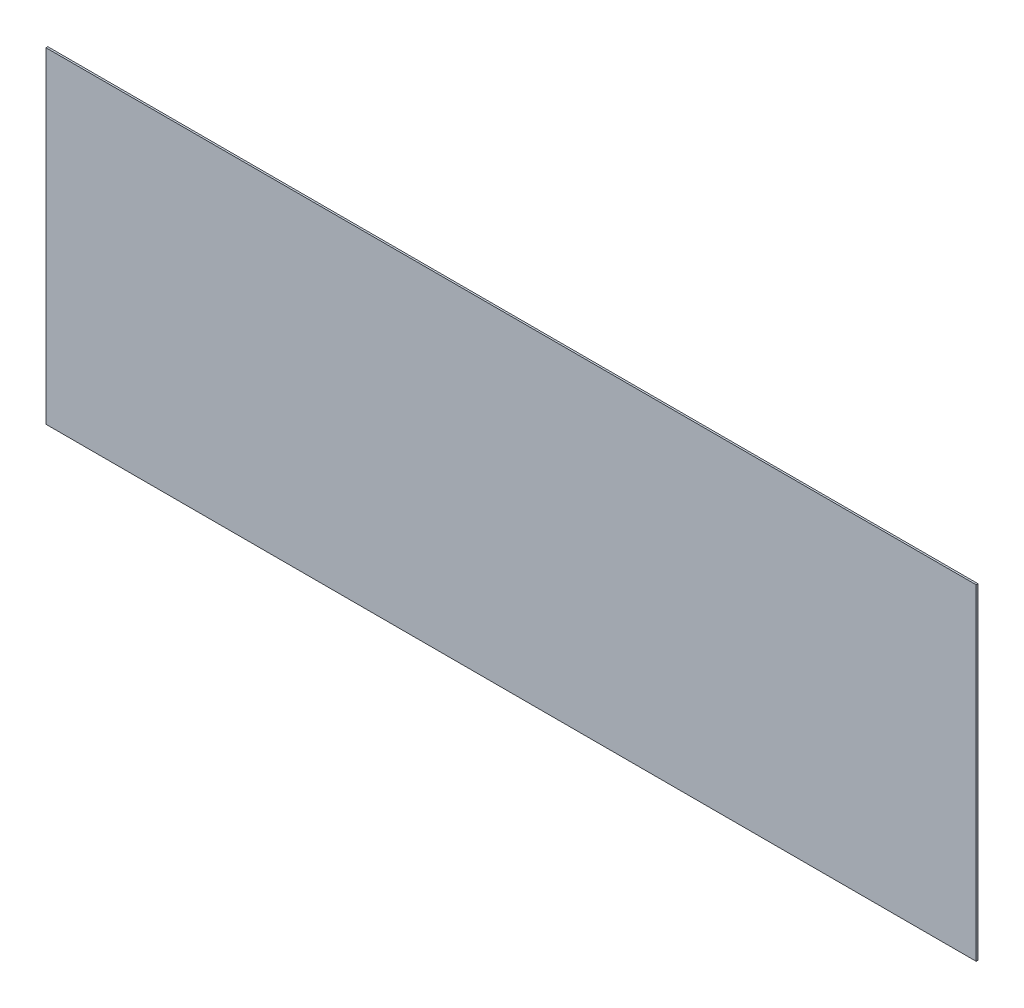
ISO-10303-21;
HEADER;
FILE_DESCRIPTION(('STEP AP214'),'2;1');
FILE_NAME('part.step','',(''),(''),'','','');
FILE_SCHEMA(('AUTOMOTIVE_DESIGN { 1 0 10303 214 1 1 1 1 }'));
ENDSEC;
DATA;
#1=APPLICATION_CONTEXT('core data for automotive mechanical design processes');
#2=APPLICATION_PROTOCOL_DEFINITION('international standard','automotive_design',2000,#1);
#3=PRODUCT_CONTEXT('',#1,'mechanical');
#4=PRODUCT('Part','Part','',(#3));
#5=PRODUCT_RELATED_PRODUCT_CATEGORY('part','',(#4));
#6=PRODUCT_DEFINITION_FORMATION('','',#4);
#7=PRODUCT_DEFINITION_CONTEXT('part definition',#1,'design');
#8=PRODUCT_DEFINITION('design','',#6,#7);
#9=PRODUCT_DEFINITION_SHAPE('','',#8);
#10=(LENGTH_UNIT() NAMED_UNIT(*) SI_UNIT(.MILLI.,.METRE.));
#11=(NAMED_UNIT(*) PLANE_ANGLE_UNIT() SI_UNIT($,.RADIAN.));
#12=(NAMED_UNIT(*) SI_UNIT($,.STERADIAN.) SOLID_ANGLE_UNIT());
#13=UNCERTAINTY_MEASURE_WITH_UNIT(LENGTH_MEASURE(1.E-05),#10,'distance_accuracy_value','');
#14=(GEOMETRIC_REPRESENTATION_CONTEXT(3) GLOBAL_UNCERTAINTY_ASSIGNED_CONTEXT((#13)) GLOBAL_UNIT_ASSIGNED_CONTEXT((#10,
#11,#12)) REPRESENTATION_CONTEXT('',''));
#15=CARTESIAN_POINT('',(0.,0.,0.));
#16=DIRECTION('',(0.,0.,1.));
#17=DIRECTION('',(1.,0.,0.));
#18=AXIS2_PLACEMENT_3D('',#15,#16,#17);
#19=CARTESIAN_POINT('',(796.925,279.4,0.));
#20=DIRECTION('',(1.,0.,0.));
#21=DIRECTION('',(0.,0.,-1.));
#22=AXIS2_PLACEMENT_3D('',#19,#20,#21);
#23=PLANE('',#22);
#24=DIRECTION('',(0.,1.,0.));
#25=VECTOR('',#24,1.);
#26=CARTESIAN_POINT('',(796.925,-279.4,0.));
#27=LINE('',#26,#25);
#28=CARTESIAN_POINT('',(796.925,-279.4,0.));
#29=VERTEX_POINT('',#28);
#30=CARTESIAN_POINT('',(796.925,279.4,0.));
#31=VERTEX_POINT('',#30);
#32=EDGE_CURVE('E34',#29,#31,#27,.T.);
#33=ORIENTED_EDGE('',*,*,#32,.F.);
#34=DIRECTION('',(0.,0.,-1.));
#35=VECTOR('',#34,1.);
#36=CARTESIAN_POINT('',(796.925,-279.4,0.));
#37=LINE('',#36,#35);
#38=CARTESIAN_POINT('',(796.925,-279.4,-3.175));
#39=VERTEX_POINT('',#38);
#40=EDGE_CURVE('E10',#29,#39,#37,.T.);
#41=ORIENTED_EDGE('',*,*,#40,.T.);
#42=DIRECTION('',(0.,-1.,0.));
#43=VECTOR('',#42,1.);
#44=CARTESIAN_POINT('',(796.925,279.4,-3.175));
#45=LINE('',#44,#43);
#46=CARTESIAN_POINT('',(796.925,279.4,-3.175));
#47=VERTEX_POINT('',#46);
#48=EDGE_CURVE('E78',#47,#39,#45,.T.);
#49=ORIENTED_EDGE('',*,*,#48,.F.);
#50=DIRECTION('',(0.,0.,-1.));
#51=VECTOR('',#50,1.);
#52=CARTESIAN_POINT('',(796.925,279.4,0.));
#53=LINE('',#52,#51);
#54=EDGE_CURVE('E26',#31,#47,#53,.T.);
#55=ORIENTED_EDGE('',*,*,#54,.F.);
#56=EDGE_LOOP('',(#33,#41,#49,#55));
#57=FACE_BOUND('',#56,.T.);
#58=ADVANCED_FACE('F16',(#57),#23,.T.);
#59=CARTESIAN_POINT('',(-796.925,279.4,0.));
#60=DIRECTION('',(0.,1.,0.));
#61=DIRECTION('',(0.,0.,1.));
#62=AXIS2_PLACEMENT_3D('',#59,#60,#61);
#63=PLANE('',#62);
#64=DIRECTION('',(-1.,0.,0.));
#65=VECTOR('',#64,1.);
#66=CARTESIAN_POINT('',(796.925,279.4,0.));
#67=LINE('',#66,#65);
#68=CARTESIAN_POINT('',(-796.925,279.4,0.));
#69=VERTEX_POINT('',#68);
#70=EDGE_CURVE('E81',#31,#69,#67,.T.);
#71=ORIENTED_EDGE('',*,*,#70,.F.);
#72=ORIENTED_EDGE('',*,*,#54,.T.);
#73=DIRECTION('',(1.,0.,0.));
#74=VECTOR('',#73,1.);
#75=CARTESIAN_POINT('',(-796.925,279.4,-3.175));
#76=LINE('',#75,#74);
#77=CARTESIAN_POINT('',(-796.925,279.4,-3.175));
#78=VERTEX_POINT('',#77);
#79=EDGE_CURVE('E70',#78,#47,#76,.T.);
#80=ORIENTED_EDGE('',*,*,#79,.F.);
#81=DIRECTION('',(0.,0.,-1.));
#82=VECTOR('',#81,1.);
#83=CARTESIAN_POINT('',(-796.925,279.4,0.));
#84=LINE('',#83,#82);
#85=EDGE_CURVE('E66',#69,#78,#84,.T.);
#86=ORIENTED_EDGE('',*,*,#85,.F.);
#87=EDGE_LOOP('',(#71,#72,#80,#86));
#88=FACE_BOUND('',#87,.T.);
#89=ADVANCED_FACE('F90',(#88),#63,.T.);
#90=CARTESIAN_POINT('',(-796.925,-279.4,0.));
#91=DIRECTION('',(-1.,0.,0.));
#92=DIRECTION('',(0.,0.,1.));
#93=AXIS2_PLACEMENT_3D('',#90,#91,#92);
#94=PLANE('',#93);
#95=DIRECTION('',(0.,-1.,0.));
#96=VECTOR('',#95,1.);
#97=CARTESIAN_POINT('',(-796.925,279.4,0.));
#98=LINE('',#97,#96);
#99=CARTESIAN_POINT('',(-796.925,-279.4,0.));
#100=VERTEX_POINT('',#99);
#101=EDGE_CURVE('E54',#69,#100,#98,.T.);
#102=ORIENTED_EDGE('',*,*,#101,.F.);
#103=ORIENTED_EDGE('',*,*,#85,.T.);
#104=DIRECTION('',(0.,1.,0.));
#105=VECTOR('',#104,1.);
#106=CARTESIAN_POINT('',(-796.925,-279.4,-3.175));
#107=LINE('',#106,#105);
#108=CARTESIAN_POINT('',(-796.925,-279.4,-3.175));
#109=VERTEX_POINT('',#108);
#110=EDGE_CURVE('E60',#109,#78,#107,.T.);
#111=ORIENTED_EDGE('',*,*,#110,.F.);
#112=DIRECTION('',(0.,0.,-1.));
#113=VECTOR('',#112,1.);
#114=CARTESIAN_POINT('',(-796.925,-279.4,0.));
#115=LINE('',#114,#113);
#116=EDGE_CURVE('E63',#100,#109,#115,.T.);
#117=ORIENTED_EDGE('',*,*,#116,.F.);
#118=EDGE_LOOP('',(#102,#103,#111,#117));
#119=FACE_BOUND('',#118,.T.);
#120=ADVANCED_FACE('F62',(#119),#94,.T.);
#121=CARTESIAN_POINT('',(796.925,-279.4,0.));
#122=DIRECTION('',(0.,-1.,0.));
#123=DIRECTION('',(0.,0.,-1.));
#124=AXIS2_PLACEMENT_3D('',#121,#122,#123);
#125=PLANE('',#124);
#126=DIRECTION('',(1.,0.,0.));
#127=VECTOR('',#126,1.);
#128=CARTESIAN_POINT('',(-796.925,-279.4,0.));
#129=LINE('',#128,#127);
#130=EDGE_CURVE('E75',#100,#29,#129,.T.);
#131=ORIENTED_EDGE('',*,*,#130,.F.);
#132=ORIENTED_EDGE('',*,*,#116,.T.);
#133=DIRECTION('',(-1.,0.,0.));
#134=VECTOR('',#133,1.);
#135=CARTESIAN_POINT('',(796.925,-279.4,-3.175));
#136=LINE('',#135,#134);
#137=EDGE_CURVE('E20',#39,#109,#136,.T.);
#138=ORIENTED_EDGE('',*,*,#137,.F.);
#139=ORIENTED_EDGE('',*,*,#40,.F.);
#140=EDGE_LOOP('',(#131,#132,#138,#139));
#141=FACE_BOUND('',#140,.T.);
#142=ADVANCED_FACE('F74',(#141),#125,.T.);
#143=CARTESIAN_POINT('',(0.,0.,-3.175));
#144=DIRECTION('',(0.,0.,1.));
#145=DIRECTION('',(1.,0.,0.));
#146=AXIS2_PLACEMENT_3D('',#143,#144,#145);
#147=PLANE('',#146);
#148=ORIENTED_EDGE('',*,*,#137,.T.);
#149=ORIENTED_EDGE('',*,*,#110,.T.);
#150=ORIENTED_EDGE('',*,*,#79,.T.);
#151=ORIENTED_EDGE('',*,*,#48,.T.);
#152=EDGE_LOOP('',(#148,#149,#150,#151));
#153=FACE_BOUND('',#152,.T.);
#154=ADVANCED_FACE('F77',(#153),#147,.F.);
#155=CARTESIAN_POINT('',(0.,0.,0.));
#156=DIRECTION('',(0.,0.,1.));
#157=DIRECTION('',(1.,0.,0.));
#158=AXIS2_PLACEMENT_3D('',#155,#156,#157);
#159=PLANE('',#158);
#160=ORIENTED_EDGE('',*,*,#130,.T.);
#161=ORIENTED_EDGE('',*,*,#32,.T.);
#162=ORIENTED_EDGE('',*,*,#70,.T.);
#163=ORIENTED_EDGE('',*,*,#101,.T.);
#164=EDGE_LOOP('',(#160,#161,#162,#163));
#165=FACE_BOUND('',#164,.T.);
#166=ADVANCED_FACE('F18',(#165),#159,.T.);
#167=CLOSED_SHELL('',(#58,#89,#120,#142,#154,#166));
#168=MANIFOLD_SOLID_BREP('B1',#167);
#169=ADVANCED_BREP_SHAPE_REPRESENTATION('',(#18,#168),#14);
#170=SHAPE_DEFINITION_REPRESENTATION(#9,#169);
ENDSEC;
END-ISO-10303-21;
